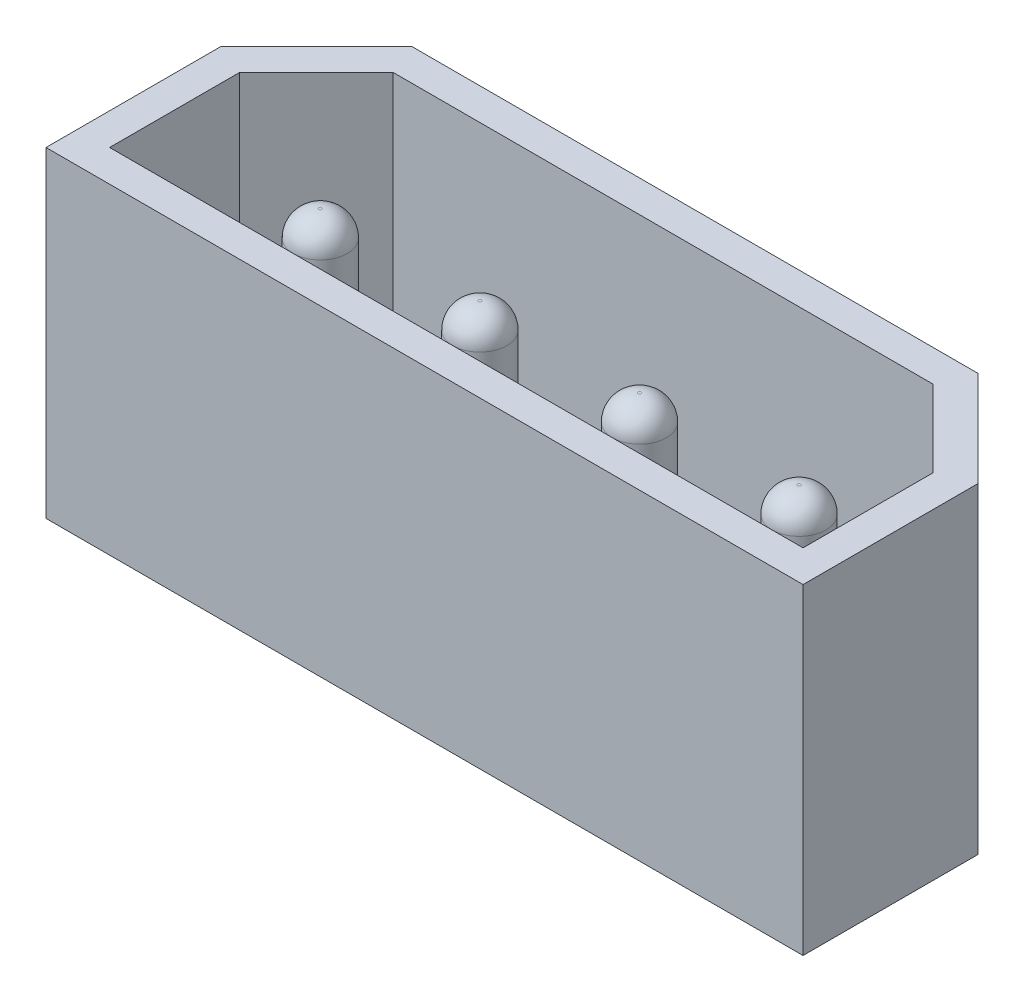
ISO-10303-21;
HEADER;
FILE_DESCRIPTION(('STEP AP214'),'2;1');
FILE_NAME('part.step','',(''),(''),'','','');
FILE_SCHEMA(('AUTOMOTIVE_DESIGN { 1 0 10303 214 1 1 1 1 }'));
ENDSEC;
DATA;
#1=APPLICATION_CONTEXT('core data for automotive mechanical design processes');
#2=APPLICATION_PROTOCOL_DEFINITION('international standard','automotive_design',2000,#1);
#3=PRODUCT_CONTEXT('',#1,'mechanical');
#4=PRODUCT('Part','Part','',(#3));
#5=PRODUCT_RELATED_PRODUCT_CATEGORY('part','',(#4));
#6=PRODUCT_DEFINITION_FORMATION('','',#4);
#7=PRODUCT_DEFINITION_CONTEXT('part definition',#1,'design');
#8=PRODUCT_DEFINITION('design','',#6,#7);
#9=PRODUCT_DEFINITION_SHAPE('','',#8);
#10=(LENGTH_UNIT() NAMED_UNIT(*) SI_UNIT(.MILLI.,.METRE.));
#11=(NAMED_UNIT(*) PLANE_ANGLE_UNIT() SI_UNIT($,.RADIAN.));
#12=(NAMED_UNIT(*) SI_UNIT($,.STERADIAN.) SOLID_ANGLE_UNIT());
#13=UNCERTAINTY_MEASURE_WITH_UNIT(LENGTH_MEASURE(1.E-05),#10,'distance_accuracy_value','');
#14=(GEOMETRIC_REPRESENTATION_CONTEXT(3) GLOBAL_UNCERTAINTY_ASSIGNED_CONTEXT((#13)) GLOBAL_UNIT_ASSIGNED_CONTEXT((#10,
#11,#12)) REPRESENTATION_CONTEXT('',''));
#15=CARTESIAN_POINT('',(0.,0.,0.));
#16=DIRECTION('',(0.,0.,1.));
#17=DIRECTION('',(1.,0.,0.));
#18=AXIS2_PLACEMENT_3D('',#15,#16,#17);
#19=CARTESIAN_POINT('',(0.,0.,0.));
#20=DIRECTION('',(0.,1.,0.));
#21=DIRECTION('',(0.,0.,1.));
#22=AXIS2_PLACEMENT_3D('',#19,#20,#21);
#23=PLANE('',#22);
#24=CARTESIAN_POINT('',(-7.525,0.,0.));
#25=DIRECTION('',(0.,1.,0.));
#26=DIRECTION('',(0.,0.,1.));
#27=AXIS2_PLACEMENT_3D('',#24,#25,#26);
#28=CIRCLE('',#27,0.85);
#29=CARTESIAN_POINT('',(-7.525,0.,0.85));
#30=VERTEX_POINT('',#29);
#31=EDGE_CURVE('E430',#30,#30,#28,.T.);
#32=ORIENTED_EDGE('',*,*,#31,.T.);
#33=EDGE_LOOP('',(#32));
#34=FACE_BOUND('',#33,.T.);
#35=CARTESIAN_POINT('',(-2.50875,0.,0.));
#36=DIRECTION('',(0.,1.,0.));
#37=DIRECTION('',(0.,0.,1.));
#38=AXIS2_PLACEMENT_3D('',#35,#36,#37);
#39=CIRCLE('',#38,0.85);
#40=CARTESIAN_POINT('',(-2.50875,0.,0.85));
#41=VERTEX_POINT('',#40);
#42=EDGE_CURVE('E426',#41,#41,#39,.T.);
#43=ORIENTED_EDGE('',*,*,#42,.T.);
#44=EDGE_LOOP('',(#43));
#45=FACE_BOUND('',#44,.T.);
#46=CARTESIAN_POINT('',(7.525,0.,0.));
#47=DIRECTION('',(0.,1.,0.));
#48=DIRECTION('',(0.,0.,1.));
#49=AXIS2_PLACEMENT_3D('',#46,#47,#48);
#50=CIRCLE('',#49,0.85);
#51=CARTESIAN_POINT('',(7.525,0.,0.849999999999998));
#52=VERTEX_POINT('',#51);
#53=EDGE_CURVE('E422',#52,#52,#50,.T.);
#54=ORIENTED_EDGE('',*,*,#53,.T.);
#55=EDGE_LOOP('',(#54));
#56=FACE_BOUND('',#55,.T.);
#57=CARTESIAN_POINT('',(2.50875,0.,0.));
#58=DIRECTION('',(0.,1.,0.));
#59=DIRECTION('',(0.,0.,1.));
#60=AXIS2_PLACEMENT_3D('',#57,#58,#59);
#61=CIRCLE('',#60,0.85);
#62=CARTESIAN_POINT('',(2.50875,0.,0.85));
#63=VERTEX_POINT('',#62);
#64=EDGE_CURVE('E419',#63,#63,#61,.T.);
#65=ORIENTED_EDGE('',*,*,#64,.T.);
#66=EDGE_LOOP('',(#65));
#67=FACE_BOUND('',#66,.T.);
#68=DIRECTION('',(-0.707106781186547,0.,0.707106781186548));
#69=VECTOR('',#68,1.);
#70=CARTESIAN_POINT('',(-11.9,0.,-1.25));
#71=LINE('',#70,#69);
#72=CARTESIAN_POINT('',(-11.3,0.,-1.85));
#73=VERTEX_POINT('',#72);
#74=CARTESIAN_POINT('',(-11.9,0.,-1.25));
#75=VERTEX_POINT('',#74);
#76=EDGE_CURVE('E191',#73,#75,#71,.T.);
#77=ORIENTED_EDGE('',*,*,#76,.F.);
#78=DIRECTION('',(1.,0.,0.));
#79=VECTOR('',#78,1.);
#80=CARTESIAN_POINT('',(0.,0.,-1.85));
#81=LINE('',#80,#79);
#82=CARTESIAN_POINT('',(11.3,0.,-1.85));
#83=VERTEX_POINT('',#82);
#84=EDGE_CURVE('E46',#73,#83,#81,.T.);
#85=ORIENTED_EDGE('',*,*,#84,.T.);
#86=DIRECTION('',(-0.707106781186547,0.,-0.707106781186548));
#87=VECTOR('',#86,1.);
#88=CARTESIAN_POINT('',(8.9,0.,-4.25));
#89=LINE('',#88,#87);
#90=CARTESIAN_POINT('',(11.9,0.,-1.25));
#91=VERTEX_POINT('',#90);
#92=EDGE_CURVE('E177',#91,#83,#89,.T.);
#93=ORIENTED_EDGE('',*,*,#92,.F.);
#94=DIRECTION('',(0.,0.,-1.));
#95=VECTOR('',#94,1.);
#96=CARTESIAN_POINT('',(11.9,0.,-1.25));
#97=LINE('',#96,#95);
#98=CARTESIAN_POINT('',(11.9,0.,4.25));
#99=VERTEX_POINT('',#98);
#100=EDGE_CURVE('E178',#99,#91,#97,.T.);
#101=ORIENTED_EDGE('',*,*,#100,.F.);
#102=DIRECTION('',(1.,0.,0.));
#103=VECTOR('',#102,1.);
#104=CARTESIAN_POINT('',(-11.9,0.,4.25));
#105=LINE('',#104,#103);
#106=CARTESIAN_POINT('',(-11.9,0.,4.25));
#107=VERTEX_POINT('',#106);
#108=EDGE_CURVE('E198',#107,#99,#105,.T.);
#109=ORIENTED_EDGE('',*,*,#108,.F.);
#110=DIRECTION('',(0.,0.,1.));
#111=VECTOR('',#110,1.);
#112=CARTESIAN_POINT('',(-11.9,0.,-1.25));
#113=LINE('',#112,#111);
#114=EDGE_CURVE('E195',#75,#107,#113,.T.);
#115=ORIENTED_EDGE('',*,*,#114,.F.);
#116=EDGE_LOOP('',(#77,#85,#93,#101,#109,#115));
#117=FACE_BOUND('',#116,.T.);
#118=ADVANCED_FACE('F37',(#34,#45,#56,#67,#117),#23,.F.);
#119=CARTESIAN_POINT('',(11.9,10.1,-1.25));
#120=DIRECTION('',(-1.,0.,0.));
#121=DIRECTION('',(0.,0.,1.));
#122=AXIS2_PLACEMENT_3D('',#119,#120,#121);
#123=PLANE('',#122);
#124=ORIENTED_EDGE('',*,*,#100,.T.);
#125=DIRECTION('',(0.,-1.,0.));
#126=VECTOR('',#125,1.);
#127=CARTESIAN_POINT('',(11.9,10.1,-1.25));
#128=LINE('',#127,#126);
#129=CARTESIAN_POINT('',(11.9,10.1,-1.25));
#130=VERTEX_POINT('',#129);
#131=EDGE_CURVE('E222',#130,#91,#128,.T.);
#132=ORIENTED_EDGE('',*,*,#131,.F.);
#133=DIRECTION('',(0.,0.,-1.));
#134=VECTOR('',#133,1.);
#135=CARTESIAN_POINT('',(11.9,10.1,-1.25));
#136=LINE('',#135,#134);
#137=CARTESIAN_POINT('',(11.9,10.1,4.25));
#138=VERTEX_POINT('',#137);
#139=EDGE_CURVE('E201',#138,#130,#136,.T.);
#140=ORIENTED_EDGE('',*,*,#139,.F.);
#141=DIRECTION('',(0.,-1.,0.));
#142=VECTOR('',#141,1.);
#143=CARTESIAN_POINT('',(11.9,10.1,4.25));
#144=LINE('',#143,#142);
#145=EDGE_CURVE('E202',#138,#99,#144,.T.);
#146=ORIENTED_EDGE('',*,*,#145,.T.);
#147=EDGE_LOOP('',(#124,#132,#140,#146));
#148=FACE_BOUND('',#147,.T.);
#149=ADVANCED_FACE('F320',(#148),#123,.F.);
#150=CARTESIAN_POINT('',(8.9,10.1,-4.25));
#151=DIRECTION('',(-0.707106781186548,0.,0.707106781186547));
#152=DIRECTION('',(0.707106781186547,0.,0.707106781186548));
#153=AXIS2_PLACEMENT_3D('',#150,#151,#152);
#154=PLANE('',#153);
#155=ORIENTED_EDGE('',*,*,#92,.T.);
#156=DIRECTION('',(0.,1.,0.));
#157=VECTOR('',#156,1.);
#158=CARTESIAN_POINT('',(11.3,10.1,-1.85));
#159=LINE('',#158,#157);
#160=CARTESIAN_POINT('',(11.3,0.8,-1.85));
#161=VERTEX_POINT('',#160);
#162=EDGE_CURVE('E314',#83,#161,#159,.T.);
#163=ORIENTED_EDGE('',*,*,#162,.T.);
#164=DIRECTION('',(0.707106781186547,0.,0.707106781186548));
#165=VECTOR('',#164,1.);
#166=CARTESIAN_POINT('',(8.9,0.8,-4.25));
#167=LINE('',#166,#165);
#168=CARTESIAN_POINT('',(9.7,0.8,-3.45));
#169=VERTEX_POINT('',#168);
#170=EDGE_CURVE('E169',#169,#161,#167,.T.);
#171=ORIENTED_EDGE('',*,*,#170,.F.);
#172=DIRECTION('',(0.,-1.,0.));
#173=VECTOR('',#172,1.);
#174=CARTESIAN_POINT('',(9.7,10.1,-3.45));
#175=LINE('',#174,#173);
#176=CARTESIAN_POINT('',(9.7,0.,-3.45));
#177=VERTEX_POINT('',#176);
#178=EDGE_CURVE('E152',#169,#177,#175,.T.);
#179=ORIENTED_EDGE('',*,*,#178,.T.);
#180=CARTESIAN_POINT('',(8.9,0.,-4.25));
#181=VERTEX_POINT('',#180);
#182=EDGE_CURVE('E166',#177,#181,#89,.T.);
#183=ORIENTED_EDGE('',*,*,#182,.T.);
#184=DIRECTION('',(0.,-1.,0.));
#185=VECTOR('',#184,1.);
#186=CARTESIAN_POINT('',(8.9,10.1,-4.25));
#187=LINE('',#186,#185);
#188=CARTESIAN_POINT('',(8.9,10.1,-4.25));
#189=VERTEX_POINT('',#188);
#190=EDGE_CURVE('E219',#189,#181,#187,.T.);
#191=ORIENTED_EDGE('',*,*,#190,.F.);
#192=DIRECTION('',(-0.707106781186547,0.,-0.707106781186548));
#193=VECTOR('',#192,1.);
#194=CARTESIAN_POINT('',(8.9,10.1,-4.25));
#195=LINE('',#194,#193);
#196=EDGE_CURVE('E316',#130,#189,#195,.T.);
#197=ORIENTED_EDGE('',*,*,#196,.F.);
#198=ORIENTED_EDGE('',*,*,#131,.T.);
#199=EDGE_LOOP('',(#155,#163,#171,#179,#183,#191,#197,#198));
#200=FACE_BOUND('',#199,.T.);
#201=ADVANCED_FACE('F164',(#200),#154,.F.);
#202=CARTESIAN_POINT('',(-8.90000000000001,10.1,-4.25));
#203=DIRECTION('',(0.,0.,1.));
#204=DIRECTION('',(1.,0.,0.));
#205=AXIS2_PLACEMENT_3D('',#202,#203,#204);
#206=PLANE('',#205);
#207=DIRECTION('',(-1.,0.,0.));
#208=VECTOR('',#207,1.);
#209=CARTESIAN_POINT('',(-8.90000000000001,0.,-4.25));
#210=LINE('',#209,#208);
#211=CARTESIAN_POINT('',(-8.90000000000001,0.,-4.25));
#212=VERTEX_POINT('',#211);
#213=EDGE_CURVE('E175',#181,#212,#210,.T.);
#214=ORIENTED_EDGE('',*,*,#213,.T.);
#215=DIRECTION('',(0.,-1.,0.));
#216=VECTOR('',#215,1.);
#217=CARTESIAN_POINT('',(-8.90000000000001,10.1,-4.25));
#218=LINE('',#217,#216);
#219=CARTESIAN_POINT('',(-8.90000000000001,10.1,-4.25));
#220=VERTEX_POINT('',#219);
#221=EDGE_CURVE('E215',#220,#212,#218,.T.);
#222=ORIENTED_EDGE('',*,*,#221,.F.);
#223=DIRECTION('',(-1.,0.,0.));
#224=VECTOR('',#223,1.);
#225=CARTESIAN_POINT('',(-8.90000000000001,10.1,-4.25));
#226=LINE('',#225,#224);
#227=EDGE_CURVE('E390',#189,#220,#226,.T.);
#228=ORIENTED_EDGE('',*,*,#227,.F.);
#229=ORIENTED_EDGE('',*,*,#190,.T.);
#230=EDGE_LOOP('',(#214,#222,#228,#229));
#231=FACE_BOUND('',#230,.T.);
#232=ADVANCED_FACE('F404',(#231),#206,.F.);
#233=CARTESIAN_POINT('',(-11.9,10.1,-1.25));
#234=DIRECTION('',(0.707106781186548,0.,0.707106781186547));
#235=DIRECTION('',(0.707106781186547,0.,-0.707106781186548));
#236=AXIS2_PLACEMENT_3D('',#233,#234,#235);
#237=PLANE('',#236);
#238=DIRECTION('',(0.707106781186547,0.,-0.707106781186548));
#239=VECTOR('',#238,1.);
#240=CARTESIAN_POINT('',(-11.9,0.8,-1.25));
#241=LINE('',#240,#239);
#242=CARTESIAN_POINT('',(-11.3,0.8,-1.85));
#243=VERTEX_POINT('',#242);
#244=CARTESIAN_POINT('',(-9.7,0.8,-3.45));
#245=VERTEX_POINT('',#244);
#246=EDGE_CURVE('E11',#243,#245,#241,.T.);
#247=ORIENTED_EDGE('',*,*,#246,.F.);
#248=DIRECTION('',(0.,-1.,0.));
#249=VECTOR('',#248,1.);
#250=CARTESIAN_POINT('',(-11.3,10.1,-1.85));
#251=LINE('',#250,#249);
#252=EDGE_CURVE('E171',#243,#73,#251,.T.);
#253=ORIENTED_EDGE('',*,*,#252,.T.);
#254=ORIENTED_EDGE('',*,*,#76,.T.);
#255=DIRECTION('',(0.,-1.,0.));
#256=VECTOR('',#255,1.);
#257=CARTESIAN_POINT('',(-11.9,10.1,-1.25));
#258=LINE('',#257,#256);
#259=CARTESIAN_POINT('',(-11.9,10.1,-1.25));
#260=VERTEX_POINT('',#259);
#261=EDGE_CURVE('E211',#260,#75,#258,.T.);
#262=ORIENTED_EDGE('',*,*,#261,.F.);
#263=DIRECTION('',(-0.707106781186547,0.,0.707106781186548));
#264=VECTOR('',#263,1.);
#265=CARTESIAN_POINT('',(-11.9,10.1,-1.25));
#266=LINE('',#265,#264);
#267=EDGE_CURVE('E336',#220,#260,#266,.T.);
#268=ORIENTED_EDGE('',*,*,#267,.F.);
#269=ORIENTED_EDGE('',*,*,#221,.T.);
#270=CARTESIAN_POINT('',(-9.7,0.,-3.45));
#271=VERTEX_POINT('',#270);
#272=EDGE_CURVE('E192',#212,#271,#71,.T.);
#273=ORIENTED_EDGE('',*,*,#272,.T.);
#274=DIRECTION('',(0.,1.,0.));
#275=VECTOR('',#274,1.);
#276=CARTESIAN_POINT('',(-9.7,10.1,-3.45));
#277=LINE('',#276,#275);
#278=EDGE_CURVE('E53',#271,#245,#277,.T.);
#279=ORIENTED_EDGE('',*,*,#278,.T.);
#280=EDGE_LOOP('',(#247,#253,#254,#262,#268,#269,#273,#279));
#281=FACE_BOUND('',#280,.T.);
#282=ADVANCED_FACE('F335',(#281),#237,.F.);
#283=CARTESIAN_POINT('',(-11.9,10.1,-1.25));
#284=DIRECTION('',(1.,0.,0.));
#285=DIRECTION('',(0.,0.,-1.));
#286=AXIS2_PLACEMENT_3D('',#283,#284,#285);
#287=PLANE('',#286);
#288=ORIENTED_EDGE('',*,*,#114,.T.);
#289=DIRECTION('',(0.,-1.,0.));
#290=VECTOR('',#289,1.);
#291=CARTESIAN_POINT('',(-11.9,10.1,4.25));
#292=LINE('',#291,#290);
#293=CARTESIAN_POINT('',(-11.9,10.1,4.25));
#294=VERTEX_POINT('',#293);
#295=EDGE_CURVE('E206',#294,#107,#292,.T.);
#296=ORIENTED_EDGE('',*,*,#295,.F.);
#297=DIRECTION('',(0.,0.,1.));
#298=VECTOR('',#297,1.);
#299=CARTESIAN_POINT('',(-11.9,10.1,-1.25));
#300=LINE('',#299,#298);
#301=EDGE_CURVE('E330',#260,#294,#300,.T.);
#302=ORIENTED_EDGE('',*,*,#301,.F.);
#303=ORIENTED_EDGE('',*,*,#261,.T.);
#304=EDGE_LOOP('',(#288,#296,#302,#303));
#305=FACE_BOUND('',#304,.T.);
#306=ADVANCED_FACE('F329',(#305),#287,.F.);
#307=CARTESIAN_POINT('',(-11.9,10.1,4.25));
#308=DIRECTION('',(0.,0.,-1.));
#309=DIRECTION('',(-1.,0.,0.));
#310=AXIS2_PLACEMENT_3D('',#307,#308,#309);
#311=PLANE('',#310);
#312=ORIENTED_EDGE('',*,*,#108,.T.);
#313=ORIENTED_EDGE('',*,*,#145,.F.);
#314=DIRECTION('',(1.,0.,0.));
#315=VECTOR('',#314,1.);
#316=CARTESIAN_POINT('',(-11.9,10.1,4.25));
#317=LINE('',#316,#315);
#318=EDGE_CURVE('E207',#294,#138,#317,.T.);
#319=ORIENTED_EDGE('',*,*,#318,.F.);
#320=ORIENTED_EDGE('',*,*,#295,.T.);
#321=EDGE_LOOP('',(#312,#313,#319,#320));
#322=FACE_BOUND('',#321,.T.);
#323=ADVANCED_FACE('F324',(#322),#311,.F.);
#324=CARTESIAN_POINT('',(0.,10.1,0.));
#325=DIRECTION('',(0.,1.,0.));
#326=DIRECTION('',(0.,0.,1.));
#327=AXIS2_PLACEMENT_3D('',#324,#325,#326);
#328=PLANE('',#327);
#329=DIRECTION('',(0.,0.,-1.));
#330=VECTOR('',#329,1.);
#331=CARTESIAN_POINT('',(10.9,10.1,-1.25));
#332=LINE('',#331,#330);
#333=CARTESIAN_POINT('',(10.9,10.1,3.25));
#334=VERTEX_POINT('',#333);
#335=CARTESIAN_POINT('',(10.9,10.1,-0.835786437626906));
#336=VERTEX_POINT('',#335);
#337=EDGE_CURVE('E369',#334,#336,#332,.T.);
#338=ORIENTED_EDGE('',*,*,#337,.F.);
#339=DIRECTION('',(1.,0.,0.));
#340=VECTOR('',#339,1.);
#341=CARTESIAN_POINT('',(-11.9,10.1,3.25));
#342=LINE('',#341,#340);
#343=CARTESIAN_POINT('',(-10.9,10.1,3.25));
#344=VERTEX_POINT('',#343);
#345=EDGE_CURVE('E384',#344,#334,#342,.T.);
#346=ORIENTED_EDGE('',*,*,#345,.F.);
#347=DIRECTION('',(0.,0.,1.));
#348=VECTOR('',#347,1.);
#349=CARTESIAN_POINT('',(-10.9,10.1,-1.25));
#350=LINE('',#349,#348);
#351=CARTESIAN_POINT('',(-10.9,10.1,-0.835786437626906));
#352=VERTEX_POINT('',#351);
#353=EDGE_CURVE('E381',#352,#344,#350,.T.);
#354=ORIENTED_EDGE('',*,*,#353,.F.);
#355=DIRECTION('',(-0.707106781186547,0.,0.707106781186548));
#356=VECTOR('',#355,1.);
#357=CARTESIAN_POINT('',(-11.1928932188135,10.1,-0.542893218813454));
#358=LINE('',#357,#356);
#359=CARTESIAN_POINT('',(-8.48578643762691,10.1,-3.25));
#360=VERTEX_POINT('',#359);
#361=EDGE_CURVE('E378',#360,#352,#358,.T.);
#362=ORIENTED_EDGE('',*,*,#361,.F.);
#363=DIRECTION('',(-1.,0.,0.));
#364=VECTOR('',#363,1.);
#365=CARTESIAN_POINT('',(-8.90000000000001,10.1,-3.25));
#366=LINE('',#365,#364);
#367=CARTESIAN_POINT('',(8.48578643762691,10.1,-3.25));
#368=VERTEX_POINT('',#367);
#369=EDGE_CURVE('E375',#368,#360,#366,.T.);
#370=ORIENTED_EDGE('',*,*,#369,.F.);
#371=DIRECTION('',(-0.707106781186547,0.,-0.707106781186548));
#372=VECTOR('',#371,1.);
#373=CARTESIAN_POINT('',(8.19289321881345,10.1,-3.54289321881345));
#374=LINE('',#373,#372);
#375=EDGE_CURVE('E372',#336,#368,#374,.T.);
#376=ORIENTED_EDGE('',*,*,#375,.F.);
#377=EDGE_LOOP('',(#338,#346,#354,#362,#370,#376));
#378=FACE_BOUND('',#377,.T.);
#379=ORIENTED_EDGE('',*,*,#139,.T.);
#380=ORIENTED_EDGE('',*,*,#196,.T.);
#381=ORIENTED_EDGE('',*,*,#227,.T.);
#382=ORIENTED_EDGE('',*,*,#267,.T.);
#383=ORIENTED_EDGE('',*,*,#301,.T.);
#384=ORIENTED_EDGE('',*,*,#318,.T.);
#385=EDGE_LOOP('',(#379,#380,#381,#382,#383,#384));
#386=FACE_BOUND('',#385,.T.);
#387=ADVANCED_FACE('F400',(#378,#386),#328,.T.);
#388=ORIENTED_EDGE('',*,*,#182,.F.);
#389=DIRECTION('',(-1.,0.,0.));
#390=VECTOR('',#389,1.);
#391=CARTESIAN_POINT('',(0.,0.,-3.45));
#392=LINE('',#391,#390);
#393=EDGE_CURVE('E149',#177,#271,#392,.T.);
#394=ORIENTED_EDGE('',*,*,#393,.T.);
#395=ORIENTED_EDGE('',*,*,#272,.F.);
#396=ORIENTED_EDGE('',*,*,#213,.F.);
#397=EDGE_LOOP('',(#388,#394,#395,#396));
#398=FACE_BOUND('',#397,.T.);
#399=ADVANCED_FACE('F174',(#398),#23,.F.);
#400=CARTESIAN_POINT('',(10.9,10.1,-1.25));
#401=DIRECTION('',(-1.,0.,0.));
#402=DIRECTION('',(0.,0.,1.));
#403=AXIS2_PLACEMENT_3D('',#400,#401,#402);
#404=PLANE('',#403);
#405=DIRECTION('',(0.,0.,-1.));
#406=VECTOR('',#405,1.);
#407=CARTESIAN_POINT('',(10.9,0.999999999999999,-1.25));
#408=LINE('',#407,#406);
#409=CARTESIAN_POINT('',(10.9,1.,3.25));
#410=VERTEX_POINT('',#409);
#411=CARTESIAN_POINT('',(10.9,1.,-0.835786437626906));
#412=VERTEX_POINT('',#411);
#413=EDGE_CURVE('E354',#410,#412,#408,.T.);
#414=ORIENTED_EDGE('',*,*,#413,.F.);
#415=DIRECTION('',(0.,-1.,0.));
#416=VECTOR('',#415,1.);
#417=CARTESIAN_POINT('',(10.9,10.1,3.25));
#418=LINE('',#417,#416);
#419=EDGE_CURVE('E366',#334,#410,#418,.T.);
#420=ORIENTED_EDGE('',*,*,#419,.F.);
#421=ORIENTED_EDGE('',*,*,#337,.T.);
#422=DIRECTION('',(0.,-1.,0.));
#423=VECTOR('',#422,1.);
#424=CARTESIAN_POINT('',(10.9,10.1,-0.835786437626906));
#425=LINE('',#424,#423);
#426=EDGE_CURVE('E185',#336,#412,#425,.T.);
#427=ORIENTED_EDGE('',*,*,#426,.T.);
#428=EDGE_LOOP('',(#414,#420,#421,#427));
#429=FACE_BOUND('',#428,.T.);
#430=ADVANCED_FACE('F447',(#429),#404,.T.);
#431=CARTESIAN_POINT('',(8.19289321881345,10.1,-3.54289321881345));
#432=DIRECTION('',(-0.707106781186548,0.,0.707106781186547));
#433=DIRECTION('',(0.707106781186547,0.,0.707106781186548));
#434=AXIS2_PLACEMENT_3D('',#431,#432,#433);
#435=PLANE('',#434);
#436=DIRECTION('',(-0.707106781186547,0.,-0.707106781186548));
#437=VECTOR('',#436,1.);
#438=CARTESIAN_POINT('',(8.19289321881345,0.999999999999999,-3.54289321881345));
#439=LINE('',#438,#437);
#440=CARTESIAN_POINT('',(8.48578643762691,1.,-3.25));
#441=VERTEX_POINT('',#440);
#442=EDGE_CURVE('E345',#412,#441,#439,.T.);
#443=ORIENTED_EDGE('',*,*,#442,.F.);
#444=ORIENTED_EDGE('',*,*,#426,.F.);
#445=ORIENTED_EDGE('',*,*,#375,.T.);
#446=DIRECTION('',(0.,-1.,0.));
#447=VECTOR('',#446,1.);
#448=CARTESIAN_POINT('',(8.48578643762691,10.1,-3.25));
#449=LINE('',#448,#447);
#450=EDGE_CURVE('E358',#368,#441,#449,.T.);
#451=ORIENTED_EDGE('',*,*,#450,.T.);
#452=EDGE_LOOP('',(#443,#444,#445,#451));
#453=FACE_BOUND('',#452,.T.);
#454=ADVANCED_FACE('F462',(#453),#435,.T.);
#455=CARTESIAN_POINT('',(-8.90000000000001,10.1,-3.25));
#456=DIRECTION('',(0.,0.,1.));
#457=DIRECTION('',(1.,0.,0.));
#458=AXIS2_PLACEMENT_3D('',#455,#456,#457);
#459=PLANE('',#458);
#460=DIRECTION('',(-1.,0.,0.));
#461=VECTOR('',#460,1.);
#462=CARTESIAN_POINT('',(-8.90000000000001,0.999999999999999,-3.25));
#463=LINE('',#462,#461);
#464=CARTESIAN_POINT('',(-8.48578643762691,1.,-3.25));
#465=VERTEX_POINT('',#464);
#466=EDGE_CURVE('E343',#441,#465,#463,.T.);
#467=ORIENTED_EDGE('',*,*,#466,.F.);
#468=ORIENTED_EDGE('',*,*,#450,.F.);
#469=ORIENTED_EDGE('',*,*,#369,.T.);
#470=DIRECTION('',(0.,-1.,0.));
#471=VECTOR('',#470,1.);
#472=CARTESIAN_POINT('',(-8.48578643762691,10.1,-3.25));
#473=LINE('',#472,#471);
#474=EDGE_CURVE('E341',#360,#465,#473,.T.);
#475=ORIENTED_EDGE('',*,*,#474,.T.);
#476=EDGE_LOOP('',(#467,#468,#469,#475));
#477=FACE_BOUND('',#476,.T.);
#478=ADVANCED_FACE('F466',(#477),#459,.T.);
#479=CARTESIAN_POINT('',(-11.1928932188135,10.1,-0.542893218813454));
#480=DIRECTION('',(0.707106781186548,0.,0.707106781186547));
#481=DIRECTION('',(0.707106781186547,0.,-0.707106781186548));
#482=AXIS2_PLACEMENT_3D('',#479,#480,#481);
#483=PLANE('',#482);
#484=DIRECTION('',(-0.707106781186547,0.,0.707106781186548));
#485=VECTOR('',#484,1.);
#486=CARTESIAN_POINT('',(-11.1928932188135,0.999999999999999,-0.542893218813454));
#487=LINE('',#486,#485);
#488=CARTESIAN_POINT('',(-10.9,1.,-0.835786437626906));
#489=VERTEX_POINT('',#488);
#490=EDGE_CURVE('E344',#465,#489,#487,.T.);
#491=ORIENTED_EDGE('',*,*,#490,.F.);
#492=ORIENTED_EDGE('',*,*,#474,.F.);
#493=ORIENTED_EDGE('',*,*,#361,.T.);
#494=DIRECTION('',(0.,-1.,0.));
#495=VECTOR('',#494,1.);
#496=CARTESIAN_POINT('',(-10.9,10.1,-0.835786437626906));
#497=LINE('',#496,#495);
#498=EDGE_CURVE('E339',#352,#489,#497,.T.);
#499=ORIENTED_EDGE('',*,*,#498,.T.);
#500=EDGE_LOOP('',(#491,#492,#493,#499));
#501=FACE_BOUND('',#500,.T.);
#502=ADVANCED_FACE('F469',(#501),#483,.T.);
#503=CARTESIAN_POINT('',(-10.9,10.1,-1.25));
#504=DIRECTION('',(1.,0.,0.));
#505=DIRECTION('',(0.,0.,-1.));
#506=AXIS2_PLACEMENT_3D('',#503,#504,#505);
#507=PLANE('',#506);
#508=DIRECTION('',(0.,0.,1.));
#509=VECTOR('',#508,1.);
#510=CARTESIAN_POINT('',(-10.9,0.999999999999999,-1.25));
#511=LINE('',#510,#509);
#512=CARTESIAN_POINT('',(-10.9,1.,3.25));
#513=VERTEX_POINT('',#512);
#514=EDGE_CURVE('E351',#489,#513,#511,.T.);
#515=ORIENTED_EDGE('',*,*,#514,.F.);
#516=ORIENTED_EDGE('',*,*,#498,.F.);
#517=ORIENTED_EDGE('',*,*,#353,.T.);
#518=DIRECTION('',(0.,-1.,0.));
#519=VECTOR('',#518,1.);
#520=CARTESIAN_POINT('',(-10.9,10.1,3.25));
#521=LINE('',#520,#519);
#522=EDGE_CURVE('E61',#344,#513,#521,.T.);
#523=ORIENTED_EDGE('',*,*,#522,.T.);
#524=EDGE_LOOP('',(#515,#516,#517,#523));
#525=FACE_BOUND('',#524,.T.);
#526=ADVANCED_FACE('F455',(#525),#507,.T.);
#527=CARTESIAN_POINT('',(-11.9,10.1,3.25));
#528=DIRECTION('',(0.,0.,-1.));
#529=DIRECTION('',(-1.,0.,0.));
#530=AXIS2_PLACEMENT_3D('',#527,#528,#529);
#531=PLANE('',#530);
#532=DIRECTION('',(1.,0.,0.));
#533=VECTOR('',#532,1.);
#534=CARTESIAN_POINT('',(-11.9,0.999999999999999,3.25));
#535=LINE('',#534,#533);
#536=EDGE_CURVE('E363',#513,#410,#535,.T.);
#537=ORIENTED_EDGE('',*,*,#536,.F.);
#538=ORIENTED_EDGE('',*,*,#522,.F.);
#539=ORIENTED_EDGE('',*,*,#345,.T.);
#540=ORIENTED_EDGE('',*,*,#419,.T.);
#541=EDGE_LOOP('',(#537,#538,#539,#540));
#542=FACE_BOUND('',#541,.T.);
#543=ADVANCED_FACE('F443',(#542),#531,.T.);
#544=CARTESIAN_POINT('',(0.,1.,0.));
#545=DIRECTION('',(0.,1.,0.));
#546=DIRECTION('',(0.,0.,1.));
#547=AXIS2_PLACEMENT_3D('',#544,#545,#546);
#548=PLANE('',#547);
#549=CARTESIAN_POINT('',(2.50875,1.,0.));
#550=DIRECTION('',(0.,1.,0.));
#551=DIRECTION('',(0.,0.,1.));
#552=AXIS2_PLACEMENT_3D('',#549,#550,#551);
#553=CIRCLE('',#552,0.85);
#554=CARTESIAN_POINT('',(2.50875,1.,0.85));
#555=VERTEX_POINT('',#554);
#556=EDGE_CURVE('E238',#555,#555,#553,.T.);
#557=ORIENTED_EDGE('',*,*,#556,.F.);
#558=EDGE_LOOP('',(#557));
#559=FACE_BOUND('',#558,.T.);
#560=CARTESIAN_POINT('',(7.525,1.,0.));
#561=DIRECTION('',(0.,1.,0.));
#562=DIRECTION('',(0.,0.,1.));
#563=AXIS2_PLACEMENT_3D('',#560,#561,#562);
#564=CIRCLE('',#563,0.85);
#565=CARTESIAN_POINT('',(7.525,1.,0.849999999999998));
#566=VERTEX_POINT('',#565);
#567=EDGE_CURVE('E234',#566,#566,#564,.T.);
#568=ORIENTED_EDGE('',*,*,#567,.F.);
#569=EDGE_LOOP('',(#568));
#570=FACE_BOUND('',#569,.T.);
#571=CARTESIAN_POINT('',(-2.50875,1.,0.));
#572=DIRECTION('',(0.,1.,0.));
#573=DIRECTION('',(0.,0.,1.));
#574=AXIS2_PLACEMENT_3D('',#571,#572,#573);
#575=CIRCLE('',#574,0.85);
#576=CARTESIAN_POINT('',(-2.50875,1.,0.85));
#577=VERTEX_POINT('',#576);
#578=EDGE_CURVE('E230',#577,#577,#575,.T.);
#579=ORIENTED_EDGE('',*,*,#578,.F.);
#580=EDGE_LOOP('',(#579));
#581=FACE_BOUND('',#580,.T.);
#582=CARTESIAN_POINT('',(-7.525,1.,0.));
#583=DIRECTION('',(0.,1.,0.));
#584=DIRECTION('',(0.,0.,1.));
#585=AXIS2_PLACEMENT_3D('',#582,#583,#584);
#586=CIRCLE('',#585,0.85);
#587=CARTESIAN_POINT('',(-7.525,1.,0.85));
#588=VERTEX_POINT('',#587);
#589=EDGE_CURVE('E226',#588,#588,#586,.T.);
#590=ORIENTED_EDGE('',*,*,#589,.F.);
#591=EDGE_LOOP('',(#590));
#592=FACE_BOUND('',#591,.T.);
#593=ORIENTED_EDGE('',*,*,#413,.T.);
#594=ORIENTED_EDGE('',*,*,#442,.T.);
#595=ORIENTED_EDGE('',*,*,#466,.T.);
#596=ORIENTED_EDGE('',*,*,#490,.T.);
#597=ORIENTED_EDGE('',*,*,#514,.T.);
#598=ORIENTED_EDGE('',*,*,#536,.T.);
#599=EDGE_LOOP('',(#593,#594,#595,#596,#597,#598));
#600=FACE_BOUND('',#599,.T.);
#601=ADVANCED_FACE('F449',(#559,#570,#581,#592,#600),#548,.T.);
#602=CARTESIAN_POINT('',(-7.525,8.5,0.));
#603=DIRECTION('',(0.,1.,0.));
#604=DIRECTION('',(0.,0.,1.));
#605=AXIS2_PLACEMENT_3D('',#602,#603,#604);
#606=PLANE('',#605);
#607=CARTESIAN_POINT('',(-7.525,8.5,0.));
#608=DIRECTION('',(0.,1.,0.));
#609=DIRECTION('',(0.,0.,1.));
#610=AXIS2_PLACEMENT_3D('',#607,#608,#609);
#611=CIRCLE('',#610,0.0499999999999997);
#612=CARTESIAN_POINT('',(-7.525,8.5,0.0499999999999997));
#613=VERTEX_POINT('',#612);
#614=EDGE_CURVE('E266',#613,#613,#611,.T.);
#615=ORIENTED_EDGE('',*,*,#614,.T.);
#616=EDGE_LOOP('',(#615));
#617=FACE_BOUND('',#616,.T.);
#618=ADVANCED_FACE('F500',(#617),#606,.T.);
#619=CARTESIAN_POINT('',(-7.525,-3.,0.));
#620=DIRECTION('',(0.,1.,0.));
#621=DIRECTION('',(0.,0.,1.));
#622=AXIS2_PLACEMENT_3D('',#619,#620,#621);
#623=CYLINDRICAL_SURFACE('',#622,0.85);
#624=CARTESIAN_POINT('',(-7.525,7.7,0.));
#625=DIRECTION('',(0.,1.,0.));
#626=DIRECTION('',(0.,0.,1.));
#627=AXIS2_PLACEMENT_3D('',#624,#625,#626);
#628=CIRCLE('',#627,0.85);
#629=CARTESIAN_POINT('',(-7.525,7.7,0.85));
#630=VERTEX_POINT('',#629);
#631=EDGE_CURVE('E270',#630,#630,#628,.F.);
#632=ORIENTED_EDGE('',*,*,#631,.T.);
#633=EDGE_LOOP('',(#632));
#634=FACE_BOUND('',#633,.T.);
#635=ORIENTED_EDGE('',*,*,#589,.T.);
#636=EDGE_LOOP('',(#635));
#637=FACE_BOUND('',#636,.T.);
#638=ADVANCED_FACE('F515',(#634,#637),#623,.T.);
#639=CARTESIAN_POINT('',(-7.525,-2.2,0.));
#640=DIRECTION('',(0.,1.,0.));
#641=DIRECTION('',(0.,0.,1.));
#642=AXIS2_PLACEMENT_3D('',#639,#640,#641);
#643=CIRCLE('',#642,0.85);
#644=CARTESIAN_POINT('',(-7.525,-2.2,0.85));
#645=VERTEX_POINT('',#644);
#646=EDGE_CURVE('E274',#645,#645,#643,.T.);
#647=ORIENTED_EDGE('',*,*,#646,.T.);
#648=EDGE_LOOP('',(#647));
#649=FACE_BOUND('',#648,.T.);
#650=ORIENTED_EDGE('',*,*,#31,.F.);
#651=EDGE_LOOP('',(#650));
#652=FACE_BOUND('',#651,.T.);
#653=ADVANCED_FACE('F522',(#649,#652),#623,.T.);
#654=CARTESIAN_POINT('',(-7.525,-3.,0.));
#655=DIRECTION('',(0.,1.,0.));
#656=DIRECTION('',(0.,0.,1.));
#657=AXIS2_PLACEMENT_3D('',#654,#655,#656);
#658=PLANE('',#657);
#659=CARTESIAN_POINT('',(-7.525,-3.,0.));
#660=DIRECTION('',(0.,1.,0.));
#661=DIRECTION('',(0.,0.,1.));
#662=AXIS2_PLACEMENT_3D('',#659,#660,#661);
#663=CIRCLE('',#662,0.0499999999999997);
#664=CARTESIAN_POINT('',(-7.525,-3.,0.0499999999999997));
#665=VERTEX_POINT('',#664);
#666=EDGE_CURVE('E278',#665,#665,#663,.F.);
#667=ORIENTED_EDGE('',*,*,#666,.T.);
#668=EDGE_LOOP('',(#667));
#669=FACE_BOUND('',#668,.T.);
#670=ADVANCED_FACE('F529',(#669),#658,.F.);
#671=CARTESIAN_POINT('',(-2.50875,8.5,0.));
#672=DIRECTION('',(0.,1.,0.));
#673=DIRECTION('',(0.,0.,1.));
#674=AXIS2_PLACEMENT_3D('',#671,#672,#673);
#675=PLANE('',#674);
#676=CARTESIAN_POINT('',(-2.50875,8.5,0.));
#677=DIRECTION('',(0.,1.,0.));
#678=DIRECTION('',(0.,0.,1.));
#679=AXIS2_PLACEMENT_3D('',#676,#677,#678);
#680=CIRCLE('',#679,0.0499999999999997);
#681=CARTESIAN_POINT('',(-2.50875,8.5,0.0499999999999997));
#682=VERTEX_POINT('',#681);
#683=EDGE_CURVE('E258',#682,#682,#680,.T.);
#684=ORIENTED_EDGE('',*,*,#683,.T.);
#685=EDGE_LOOP('',(#684));
#686=FACE_BOUND('',#685,.T.);
#687=ADVANCED_FACE('F535',(#686),#675,.T.);
#688=CARTESIAN_POINT('',(-2.50875,-3.,0.));
#689=DIRECTION('',(0.,1.,0.));
#690=DIRECTION('',(0.,0.,1.));
#691=AXIS2_PLACEMENT_3D('',#688,#689,#690);
#692=CYLINDRICAL_SURFACE('',#691,0.85);
#693=CARTESIAN_POINT('',(-2.50875,7.7,0.));
#694=DIRECTION('',(0.,1.,0.));
#695=DIRECTION('',(0.,0.,1.));
#696=AXIS2_PLACEMENT_3D('',#693,#694,#695);
#697=CIRCLE('',#696,0.85);
#698=CARTESIAN_POINT('',(-2.50875,7.7,0.85));
#699=VERTEX_POINT('',#698);
#700=EDGE_CURVE('E262',#699,#699,#697,.F.);
#701=ORIENTED_EDGE('',*,*,#700,.T.);
#702=EDGE_LOOP('',(#701));
#703=FACE_BOUND('',#702,.T.);
#704=ORIENTED_EDGE('',*,*,#578,.T.);
#705=EDGE_LOOP('',(#704));
#706=FACE_BOUND('',#705,.T.);
#707=ADVANCED_FACE('F542',(#703,#706),#692,.T.);
#708=CARTESIAN_POINT('',(-2.50875,-2.2,0.));
#709=DIRECTION('',(0.,1.,0.));
#710=DIRECTION('',(0.,0.,1.));
#711=AXIS2_PLACEMENT_3D('',#708,#709,#710);
#712=CIRCLE('',#711,0.85);
#713=CARTESIAN_POINT('',(-2.50875,-2.2,0.85));
#714=VERTEX_POINT('',#713);
#715=EDGE_CURVE('E282',#714,#714,#712,.T.);
#716=ORIENTED_EDGE('',*,*,#715,.T.);
#717=EDGE_LOOP('',(#716));
#718=FACE_BOUND('',#717,.T.);
#719=ORIENTED_EDGE('',*,*,#42,.F.);
#720=EDGE_LOOP('',(#719));
#721=FACE_BOUND('',#720,.T.);
#722=ADVANCED_FACE('F549',(#718,#721),#692,.T.);
#723=CARTESIAN_POINT('',(-2.50875,-3.,0.));
#724=DIRECTION('',(0.,1.,0.));
#725=DIRECTION('',(0.,0.,1.));
#726=AXIS2_PLACEMENT_3D('',#723,#724,#725);
#727=PLANE('',#726);
#728=CARTESIAN_POINT('',(-2.50875,-3.,0.));
#729=DIRECTION('',(0.,1.,0.));
#730=DIRECTION('',(0.,0.,1.));
#731=AXIS2_PLACEMENT_3D('',#728,#729,#730);
#732=CIRCLE('',#731,0.0499999999999997);
#733=CARTESIAN_POINT('',(-2.50875,-3.,0.0499999999999997));
#734=VERTEX_POINT('',#733);
#735=EDGE_CURVE('E286',#734,#734,#732,.F.);
#736=ORIENTED_EDGE('',*,*,#735,.T.);
#737=EDGE_LOOP('',(#736));
#738=FACE_BOUND('',#737,.T.);
#739=ADVANCED_FACE('F556',(#738),#727,.F.);
#740=CARTESIAN_POINT('',(7.525,8.5,0.));
#741=DIRECTION('',(0.,-1.,0.));
#742=DIRECTION('',(0.,0.,-1.));
#743=AXIS2_PLACEMENT_3D('',#740,#741,#742);
#744=PLANE('',#743);
#745=CARTESIAN_POINT('',(7.525,8.5,0.));
#746=DIRECTION('',(0.,-1.,0.));
#747=DIRECTION('',(0.,0.,-1.));
#748=AXIS2_PLACEMENT_3D('',#745,#746,#747);
#749=CIRCLE('',#748,0.0499999999999997);
#750=CARTESIAN_POINT('',(7.525,8.5,-0.0500000000000015));
#751=VERTEX_POINT('',#750);
#752=EDGE_CURVE('E242',#751,#751,#749,.F.);
#753=ORIENTED_EDGE('',*,*,#752,.T.);
#754=EDGE_LOOP('',(#753));
#755=FACE_BOUND('',#754,.T.);
#756=ADVANCED_FACE('F562',(#755),#744,.F.);
#757=CARTESIAN_POINT('',(7.525,-3.,0.));
#758=DIRECTION('',(0.,1.,0.));
#759=DIRECTION('',(0.,0.,1.));
#760=AXIS2_PLACEMENT_3D('',#757,#758,#759);
#761=CYLINDRICAL_SURFACE('',#760,0.85);
#762=CARTESIAN_POINT('',(7.525,7.7,0.));
#763=DIRECTION('',(0.,-1.,0.));
#764=DIRECTION('',(0.,0.,-1.));
#765=AXIS2_PLACEMENT_3D('',#762,#763,#764);
#766=CIRCLE('',#765,0.85);
#767=CARTESIAN_POINT('',(7.525,7.7,-0.850000000000002));
#768=VERTEX_POINT('',#767);
#769=EDGE_CURVE('E246',#768,#768,#766,.T.);
#770=ORIENTED_EDGE('',*,*,#769,.T.);
#771=EDGE_LOOP('',(#770));
#772=FACE_BOUND('',#771,.T.);
#773=ORIENTED_EDGE('',*,*,#567,.T.);
#774=EDGE_LOOP('',(#773));
#775=FACE_BOUND('',#774,.T.);
#776=ADVANCED_FACE('F569',(#772,#775),#761,.T.);
#777=CARTESIAN_POINT('',(7.525,-2.2,0.));
#778=DIRECTION('',(0.,-1.,0.));
#779=DIRECTION('',(0.,0.,-1.));
#780=AXIS2_PLACEMENT_3D('',#777,#778,#779);
#781=CIRCLE('',#780,0.85);
#782=CARTESIAN_POINT('',(7.525,-2.2,-0.850000000000002));
#783=VERTEX_POINT('',#782);
#784=EDGE_CURVE('E298',#783,#783,#781,.F.);
#785=ORIENTED_EDGE('',*,*,#784,.T.);
#786=EDGE_LOOP('',(#785));
#787=FACE_BOUND('',#786,.T.);
#788=ORIENTED_EDGE('',*,*,#53,.F.);
#789=EDGE_LOOP('',(#788));
#790=FACE_BOUND('',#789,.T.);
#791=ADVANCED_FACE('F576',(#787,#790),#761,.T.);
#792=CARTESIAN_POINT('',(7.525,-3.,0.));
#793=DIRECTION('',(0.,-1.,0.));
#794=DIRECTION('',(0.,0.,-1.));
#795=AXIS2_PLACEMENT_3D('',#792,#793,#794);
#796=PLANE('',#795);
#797=CARTESIAN_POINT('',(7.525,-3.,0.));
#798=DIRECTION('',(0.,-1.,0.));
#799=DIRECTION('',(0.,0.,-1.));
#800=AXIS2_PLACEMENT_3D('',#797,#798,#799);
#801=CIRCLE('',#800,0.0499999999999997);
#802=CARTESIAN_POINT('',(7.525,-3.,-0.0500000000000015));
#803=VERTEX_POINT('',#802);
#804=EDGE_CURVE('E159',#803,#803,#801,.T.);
#805=ORIENTED_EDGE('',*,*,#804,.T.);
#806=EDGE_LOOP('',(#805));
#807=FACE_BOUND('',#806,.T.);
#808=ADVANCED_FACE('F583',(#807),#796,.T.);
#809=CARTESIAN_POINT('',(2.50875,8.5,0.));
#810=DIRECTION('',(0.,-1.,0.));
#811=DIRECTION('',(0.,0.,-1.));
#812=AXIS2_PLACEMENT_3D('',#809,#810,#811);
#813=PLANE('',#812);
#814=CARTESIAN_POINT('',(2.50875,8.5,0.));
#815=DIRECTION('',(0.,-1.,0.));
#816=DIRECTION('',(0.,0.,-1.));
#817=AXIS2_PLACEMENT_3D('',#814,#815,#816);
#818=CIRCLE('',#817,0.0499999999999997);
#819=CARTESIAN_POINT('',(2.50875,8.5,-0.0499999999999997));
#820=VERTEX_POINT('',#819);
#821=EDGE_CURVE('E250',#820,#820,#818,.F.);
#822=ORIENTED_EDGE('',*,*,#821,.T.);
#823=EDGE_LOOP('',(#822));
#824=FACE_BOUND('',#823,.T.);
#825=ADVANCED_FACE('F589',(#824),#813,.F.);
#826=CARTESIAN_POINT('',(2.50875,-3.,0.));
#827=DIRECTION('',(0.,1.,0.));
#828=DIRECTION('',(0.,0.,1.));
#829=AXIS2_PLACEMENT_3D('',#826,#827,#828);
#830=CYLINDRICAL_SURFACE('',#829,0.85);
#831=CARTESIAN_POINT('',(2.50875,7.7,0.));
#832=DIRECTION('',(0.,-1.,0.));
#833=DIRECTION('',(0.,0.,-1.));
#834=AXIS2_PLACEMENT_3D('',#831,#832,#833);
#835=CIRCLE('',#834,0.85);
#836=CARTESIAN_POINT('',(2.50875,7.7,-0.85));
#837=VERTEX_POINT('',#836);
#838=EDGE_CURVE('E254',#837,#837,#835,.T.);
#839=ORIENTED_EDGE('',*,*,#838,.T.);
#840=EDGE_LOOP('',(#839));
#841=FACE_BOUND('',#840,.T.);
#842=ORIENTED_EDGE('',*,*,#556,.T.);
#843=EDGE_LOOP('',(#842));
#844=FACE_BOUND('',#843,.T.);
#845=ADVANCED_FACE('F596',(#841,#844),#830,.T.);
#846=CARTESIAN_POINT('',(2.50875,-2.2,0.));
#847=DIRECTION('',(0.,-1.,0.));
#848=DIRECTION('',(0.,0.,-1.));
#849=AXIS2_PLACEMENT_3D('',#846,#847,#848);
#850=CIRCLE('',#849,0.85);
#851=CARTESIAN_POINT('',(2.50875,-2.2,-0.85));
#852=VERTEX_POINT('',#851);
#853=EDGE_CURVE('E290',#852,#852,#850,.F.);
#854=ORIENTED_EDGE('',*,*,#853,.T.);
#855=EDGE_LOOP('',(#854));
#856=FACE_BOUND('',#855,.T.);
#857=ORIENTED_EDGE('',*,*,#64,.F.);
#858=EDGE_LOOP('',(#857));
#859=FACE_BOUND('',#858,.T.);
#860=ADVANCED_FACE('F603',(#856,#859),#830,.T.);
#861=CARTESIAN_POINT('',(2.50875,-3.,0.));
#862=DIRECTION('',(0.,-1.,0.));
#863=DIRECTION('',(0.,0.,-1.));
#864=AXIS2_PLACEMENT_3D('',#861,#862,#863);
#865=PLANE('',#864);
#866=CARTESIAN_POINT('',(2.50875,-3.,0.));
#867=DIRECTION('',(0.,-1.,0.));
#868=DIRECTION('',(0.,0.,-1.));
#869=AXIS2_PLACEMENT_3D('',#866,#867,#868);
#870=CIRCLE('',#869,0.0499999999999997);
#871=CARTESIAN_POINT('',(2.50875,-3.,-0.0499999999999997));
#872=VERTEX_POINT('',#871);
#873=EDGE_CURVE('E294',#872,#872,#870,.T.);
#874=ORIENTED_EDGE('',*,*,#873,.T.);
#875=EDGE_LOOP('',(#874));
#876=FACE_BOUND('',#875,.T.);
#877=ADVANCED_FACE('F610',(#876),#865,.T.);
#878=CARTESIAN_POINT('',(7.525,7.7,0.));
#879=DIRECTION('',(0.,-1.,0.));
#880=DIRECTION('',(0.,0.,-1.));
#881=AXIS2_PLACEMENT_3D('',#878,#879,#880);
#882=DEGENERATE_TOROIDAL_SURFACE('',#881,0.0499999999999997,0.8,.T.);
#883=ORIENTED_EDGE('',*,*,#769,.F.);
#884=EDGE_LOOP('',(#883));
#885=FACE_BOUND('',#884,.T.);
#886=ORIENTED_EDGE('',*,*,#752,.F.);
#887=EDGE_LOOP('',(#886));
#888=FACE_BOUND('',#887,.T.);
#889=ADVANCED_FACE('F616',(#885,#888),#882,.T.);
#890=CARTESIAN_POINT('',(2.50875,7.7,0.));
#891=DIRECTION('',(0.,-1.,0.));
#892=DIRECTION('',(0.,0.,-1.));
#893=AXIS2_PLACEMENT_3D('',#890,#891,#892);
#894=DEGENERATE_TOROIDAL_SURFACE('',#893,0.0499999999999997,0.8,.T.);
#895=ORIENTED_EDGE('',*,*,#838,.F.);
#896=EDGE_LOOP('',(#895));
#897=FACE_BOUND('',#896,.T.);
#898=ORIENTED_EDGE('',*,*,#821,.F.);
#899=EDGE_LOOP('',(#898));
#900=FACE_BOUND('',#899,.T.);
#901=ADVANCED_FACE('F623',(#897,#900),#894,.T.);
#902=CARTESIAN_POINT('',(-2.50875,7.7,0.));
#903=DIRECTION('',(0.,1.,0.));
#904=DIRECTION('',(0.,0.,1.));
#905=AXIS2_PLACEMENT_3D('',#902,#903,#904);
#906=DEGENERATE_TOROIDAL_SURFACE('',#905,0.0499999999999997,0.8,.T.);
#907=ORIENTED_EDGE('',*,*,#700,.F.);
#908=EDGE_LOOP('',(#907));
#909=FACE_BOUND('',#908,.T.);
#910=ORIENTED_EDGE('',*,*,#683,.F.);
#911=EDGE_LOOP('',(#910));
#912=FACE_BOUND('',#911,.T.);
#913=ADVANCED_FACE('F630',(#909,#912),#906,.T.);
#914=CARTESIAN_POINT('',(-7.525,7.7,0.));
#915=DIRECTION('',(0.,1.,0.));
#916=DIRECTION('',(0.,0.,1.));
#917=AXIS2_PLACEMENT_3D('',#914,#915,#916);
#918=DEGENERATE_TOROIDAL_SURFACE('',#917,0.0499999999999997,0.8,.T.);
#919=ORIENTED_EDGE('',*,*,#631,.F.);
#920=EDGE_LOOP('',(#919));
#921=FACE_BOUND('',#920,.T.);
#922=ORIENTED_EDGE('',*,*,#614,.F.);
#923=EDGE_LOOP('',(#922));
#924=FACE_BOUND('',#923,.T.);
#925=ADVANCED_FACE('F637',(#921,#924),#918,.T.);
#926=CARTESIAN_POINT('',(-7.525,-2.2,0.));
#927=DIRECTION('',(0.,1.,0.));
#928=DIRECTION('',(0.,0.,1.));
#929=AXIS2_PLACEMENT_3D('',#926,#927,#928);
#930=DEGENERATE_TOROIDAL_SURFACE('',#929,0.0499999999999997,0.8,.T.);
#931=ORIENTED_EDGE('',*,*,#666,.F.);
#932=EDGE_LOOP('',(#931));
#933=FACE_BOUND('',#932,.T.);
#934=ORIENTED_EDGE('',*,*,#646,.F.);
#935=EDGE_LOOP('',(#934));
#936=FACE_BOUND('',#935,.T.);
#937=ADVANCED_FACE('F644',(#933,#936),#930,.T.);
#938=CARTESIAN_POINT('',(-2.50875,-2.2,0.));
#939=DIRECTION('',(0.,1.,0.));
#940=DIRECTION('',(0.,0.,1.));
#941=AXIS2_PLACEMENT_3D('',#938,#939,#940);
#942=DEGENERATE_TOROIDAL_SURFACE('',#941,0.0499999999999997,0.8,.T.);
#943=ORIENTED_EDGE('',*,*,#735,.F.);
#944=EDGE_LOOP('',(#943));
#945=FACE_BOUND('',#944,.T.);
#946=ORIENTED_EDGE('',*,*,#715,.F.);
#947=EDGE_LOOP('',(#946));
#948=FACE_BOUND('',#947,.T.);
#949=ADVANCED_FACE('F651',(#945,#948),#942,.T.);
#950=CARTESIAN_POINT('',(2.50875,-2.2,0.));
#951=DIRECTION('',(0.,-1.,0.));
#952=DIRECTION('',(0.,0.,-1.));
#953=AXIS2_PLACEMENT_3D('',#950,#951,#952);
#954=DEGENERATE_TOROIDAL_SURFACE('',#953,0.0499999999999997,0.8,.T.);
#955=ORIENTED_EDGE('',*,*,#873,.F.);
#956=EDGE_LOOP('',(#955));
#957=FACE_BOUND('',#956,.T.);
#958=ORIENTED_EDGE('',*,*,#853,.F.);
#959=EDGE_LOOP('',(#958));
#960=FACE_BOUND('',#959,.T.);
#961=ADVANCED_FACE('F658',(#957,#960),#954,.T.);
#962=CARTESIAN_POINT('',(7.525,-2.2,0.));
#963=DIRECTION('',(0.,-1.,0.));
#964=DIRECTION('',(0.,0.,-1.));
#965=AXIS2_PLACEMENT_3D('',#962,#963,#964);
#966=DEGENERATE_TOROIDAL_SURFACE('',#965,0.0499999999999997,0.8,.T.);
#967=ORIENTED_EDGE('',*,*,#804,.F.);
#968=EDGE_LOOP('',(#967));
#969=FACE_BOUND('',#968,.T.);
#970=ORIENTED_EDGE('',*,*,#784,.F.);
#971=EDGE_LOOP('',(#970));
#972=FACE_BOUND('',#971,.T.);
#973=ADVANCED_FACE('F39',(#969,#972),#966,.T.);
#974=CARTESIAN_POINT('',(0.,0.8,0.));
#975=DIRECTION('',(0.,-1.,0.));
#976=DIRECTION('',(0.,0.,-1.));
#977=AXIS2_PLACEMENT_3D('',#974,#975,#976);
#978=PLANE('',#977);
#979=ORIENTED_EDGE('',*,*,#170,.T.);
#980=DIRECTION('',(-1.,0.,0.));
#981=VECTOR('',#980,1.);
#982=CARTESIAN_POINT('',(-12.1681414121147,0.8,-1.85));
#983=LINE('',#982,#981);
#984=EDGE_CURVE('E406',#161,#243,#983,.T.);
#985=ORIENTED_EDGE('',*,*,#984,.T.);
#986=ORIENTED_EDGE('',*,*,#246,.T.);
#987=DIRECTION('',(1.,0.,0.));
#988=VECTOR('',#987,1.);
#989=CARTESIAN_POINT('',(-12.1681414121147,0.8,-3.45));
#990=LINE('',#989,#988);
#991=EDGE_CURVE('E409',#245,#169,#990,.T.);
#992=ORIENTED_EDGE('',*,*,#991,.T.);
#993=EDGE_LOOP('',(#979,#985,#986,#992));
#994=FACE_BOUND('',#993,.T.);
#995=ADVANCED_FACE('F670',(#994),#978,.T.);
#996=CARTESIAN_POINT('',(-12.1681414121147,0.8,-1.85));
#997=DIRECTION('',(0.,0.,1.));
#998=DIRECTION('',(1.,0.,0.));
#999=AXIS2_PLACEMENT_3D('',#996,#997,#998);
#1000=PLANE('',#999);
#1001=ORIENTED_EDGE('',*,*,#84,.F.);
#1002=ORIENTED_EDGE('',*,*,#252,.F.);
#1003=ORIENTED_EDGE('',*,*,#984,.F.);
#1004=ORIENTED_EDGE('',*,*,#162,.F.);
#1005=EDGE_LOOP('',(#1001,#1002,#1003,#1004));
#1006=FACE_BOUND('',#1005,.T.);
#1007=ADVANCED_FACE('F676',(#1006),#1000,.F.);
#1008=CARTESIAN_POINT('',(-12.1681414121147,0.8,-3.45));
#1009=DIRECTION('',(0.,0.,-1.));
#1010=DIRECTION('',(-1.,0.,0.));
#1011=AXIS2_PLACEMENT_3D('',#1008,#1009,#1010);
#1012=PLANE('',#1011);
#1013=ORIENTED_EDGE('',*,*,#991,.F.);
#1014=ORIENTED_EDGE('',*,*,#278,.F.);
#1015=ORIENTED_EDGE('',*,*,#393,.F.);
#1016=ORIENTED_EDGE('',*,*,#178,.F.);
#1017=EDGE_LOOP('',(#1013,#1014,#1015,#1016));
#1018=FACE_BOUND('',#1017,.T.);
#1019=ADVANCED_FACE('F151',(#1018),#1012,.F.);
#1020=CLOSED_SHELL('',(#118,#149,#201,#232,#282,#306,#323,#387,#399,#430,#454,#478,#502,#526,
#543,#601,#618,#638,#653,#670,#687,#707,#722,#739,#756,#776,#791,#808,#825,#845,#860,#877,#889,
#901,#913,#925,#937,#949,#961,#973,#995,#1007,#1019));
#1021=MANIFOLD_SOLID_BREP('B2',#1020);
#1022=ADVANCED_BREP_SHAPE_REPRESENTATION('',(#18,#1021),#14);
#1023=SHAPE_DEFINITION_REPRESENTATION(#9,#1022);
ENDSEC;
END-ISO-10303-21;
